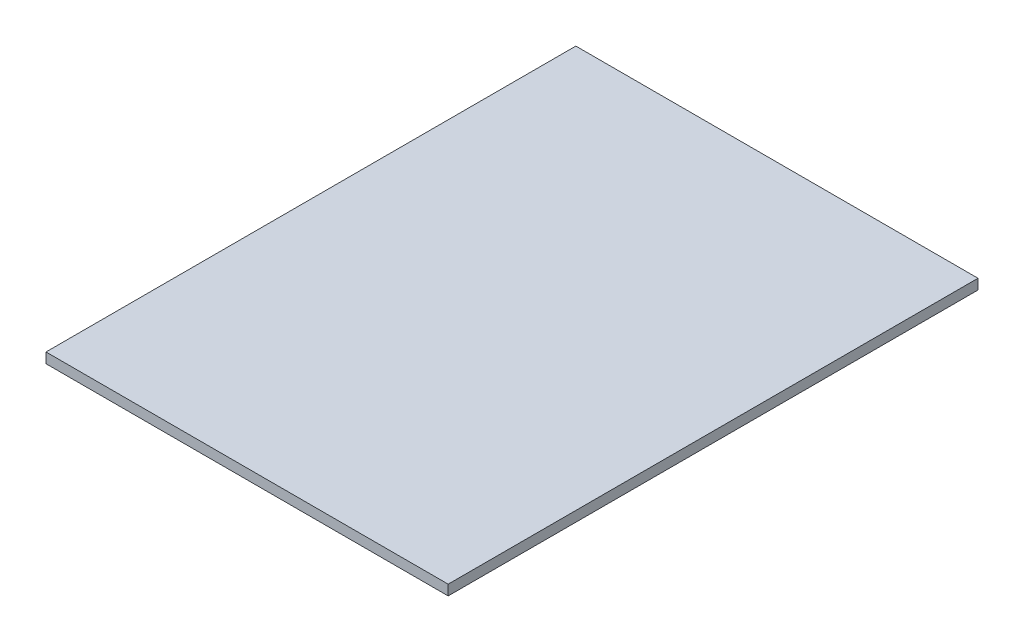
ISO-10303-21;
HEADER;
FILE_DESCRIPTION(('STEP AP214'),'2;1');
FILE_NAME('part.step','',(''),(''),'','','');
FILE_SCHEMA(('AUTOMOTIVE_DESIGN { 1 0 10303 214 1 1 1 1 }'));
ENDSEC;
DATA;
#1=APPLICATION_CONTEXT('core data for automotive mechanical design processes');
#2=APPLICATION_PROTOCOL_DEFINITION('international standard','automotive_design',2000,#1);
#3=PRODUCT_CONTEXT('',#1,'mechanical');
#4=PRODUCT('Part','Part','',(#3));
#5=PRODUCT_RELATED_PRODUCT_CATEGORY('part','',(#4));
#6=PRODUCT_DEFINITION_FORMATION('','',#4);
#7=PRODUCT_DEFINITION_CONTEXT('part definition',#1,'design');
#8=PRODUCT_DEFINITION('design','',#6,#7);
#9=PRODUCT_DEFINITION_SHAPE('','',#8);
#10=(LENGTH_UNIT() NAMED_UNIT(*) SI_UNIT(.MILLI.,.METRE.));
#11=(NAMED_UNIT(*) PLANE_ANGLE_UNIT() SI_UNIT($,.RADIAN.));
#12=(NAMED_UNIT(*) SI_UNIT($,.STERADIAN.) SOLID_ANGLE_UNIT());
#13=UNCERTAINTY_MEASURE_WITH_UNIT(LENGTH_MEASURE(1.E-05),#10,'distance_accuracy_value','');
#14=(GEOMETRIC_REPRESENTATION_CONTEXT(3) GLOBAL_UNCERTAINTY_ASSIGNED_CONTEXT((#13)) GLOBAL_UNIT_ASSIGNED_CONTEXT((#10,
#11,#12)) REPRESENTATION_CONTEXT('',''));
#15=CARTESIAN_POINT('',(0.,0.,0.));
#16=DIRECTION('',(0.,0.,1.));
#17=DIRECTION('',(1.,0.,0.));
#18=AXIS2_PLACEMENT_3D('',#15,#16,#17);
#19=CARTESIAN_POINT('',(-34.115,5.44999999999999,-41.5));
#20=DIRECTION('',(0.,0.,-1.));
#21=DIRECTION('',(-1.,0.,0.));
#22=AXIS2_PLACEMENT_3D('',#19,#20,#21);
#23=PLANE('',#22);
#24=DIRECTION('',(-1.,0.,0.));
#25=VECTOR('',#24,1.);
#26=CARTESIAN_POINT('',(31.5,-5.5,-41.5));
#27=LINE('',#26,#25);
#28=CARTESIAN_POINT('',(31.5,-5.5,-41.5));
#29=VERTEX_POINT('',#28);
#30=CARTESIAN_POINT('',(-31.5,-5.49999999999999,-41.5));
#31=VERTEX_POINT('',#30);
#32=EDGE_CURVE('E52',#29,#31,#27,.T.);
#33=ORIENTED_EDGE('',*,*,#32,.F.);
#34=DIRECTION('',(0.,1.,0.));
#35=VECTOR('',#34,1.);
#36=CARTESIAN_POINT('',(31.5,-5.5,-41.5));
#37=LINE('',#36,#35);
#38=CARTESIAN_POINT('',(31.5,-7.1,-41.5));
#39=VERTEX_POINT('',#38);
#40=EDGE_CURVE('E118',#39,#29,#37,.T.);
#41=ORIENTED_EDGE('',*,*,#40,.F.);
#42=DIRECTION('',(1.,0.,0.));
#43=VECTOR('',#42,1.);
#44=CARTESIAN_POINT('',(31.5,-7.1,-41.5));
#45=LINE('',#44,#43);
#46=CARTESIAN_POINT('',(-31.5,-7.09999999999999,-41.5));
#47=VERTEX_POINT('',#46);
#48=EDGE_CURVE('E67',#47,#39,#45,.T.);
#49=ORIENTED_EDGE('',*,*,#48,.F.);
#50=DIRECTION('',(0.,-1.,0.));
#51=VECTOR('',#50,1.);
#52=CARTESIAN_POINT('',(-31.5,-5.49999999999999,-41.5));
#53=LINE('',#52,#51);
#54=EDGE_CURVE('E58',#31,#47,#53,.T.);
#55=ORIENTED_EDGE('',*,*,#54,.F.);
#56=EDGE_LOOP('',(#33,#41,#49,#55));
#57=FACE_BOUND('',#56,.T.);
#58=ADVANCED_FACE('F44',(#57),#23,.T.);
#59=CARTESIAN_POINT('',(-31.5,-5.49999999999999,-104.67031418519));
#60=DIRECTION('',(-1.,0.,0.));
#61=DIRECTION('',(0.,0.,1.));
#62=AXIS2_PLACEMENT_3D('',#59,#60,#61);
#63=PLANE('',#62);
#64=DIRECTION('',(0.,0.,1.));
#65=VECTOR('',#64,1.);
#66=CARTESIAN_POINT('',(-31.5,-5.49999999999999,-104.67031418519));
#67=LINE('',#66,#65);
#68=CARTESIAN_POINT('',(-31.5,-5.49999999999999,41.5));
#69=VERTEX_POINT('',#68);
#70=EDGE_CURVE('E11',#31,#69,#67,.T.);
#71=ORIENTED_EDGE('',*,*,#70,.F.);
#72=ORIENTED_EDGE('',*,*,#54,.T.);
#73=DIRECTION('',(0.,0.,1.));
#74=VECTOR('',#73,1.);
#75=CARTESIAN_POINT('',(-31.5,-7.09999999999999,-104.67031418519));
#76=LINE('',#75,#74);
#77=CARTESIAN_POINT('',(-31.5,-7.09999999999999,41.5));
#78=VERTEX_POINT('',#77);
#79=EDGE_CURVE('E105',#47,#78,#76,.T.);
#80=ORIENTED_EDGE('',*,*,#79,.T.);
#81=DIRECTION('',(0.,-1.,0.));
#82=VECTOR('',#81,1.);
#83=CARTESIAN_POINT('',(-31.5,-5.49999999999999,41.5));
#84=LINE('',#83,#82);
#85=EDGE_CURVE('E99',#69,#78,#84,.T.);
#86=ORIENTED_EDGE('',*,*,#85,.F.);
#87=EDGE_LOOP('',(#71,#72,#80,#86));
#88=FACE_BOUND('',#87,.T.);
#89=ADVANCED_FACE('F102',(#88),#63,.T.);
#90=CARTESIAN_POINT('',(31.5,-7.1,-104.67031418519));
#91=DIRECTION('',(0.,-1.,0.));
#92=DIRECTION('',(1.,0.,0.));
#93=AXIS2_PLACEMENT_3D('',#90,#91,#92);
#94=PLANE('',#93);
#95=ORIENTED_EDGE('',*,*,#79,.F.);
#96=ORIENTED_EDGE('',*,*,#48,.T.);
#97=DIRECTION('',(0.,0.,1.));
#98=VECTOR('',#97,1.);
#99=CARTESIAN_POINT('',(31.5,-7.1,-104.67031418519));
#100=LINE('',#99,#98);
#101=CARTESIAN_POINT('',(31.5,-7.1,41.5));
#102=VERTEX_POINT('',#101);
#103=EDGE_CURVE('E90',#39,#102,#100,.T.);
#104=ORIENTED_EDGE('',*,*,#103,.T.);
#105=DIRECTION('',(1.,0.,0.));
#106=VECTOR('',#105,1.);
#107=CARTESIAN_POINT('',(31.5,-7.1,41.5));
#108=LINE('',#107,#106);
#109=EDGE_CURVE('E107',#78,#102,#108,.T.);
#110=ORIENTED_EDGE('',*,*,#109,.F.);
#111=EDGE_LOOP('',(#95,#96,#104,#110));
#112=FACE_BOUND('',#111,.T.);
#113=ADVANCED_FACE('F127',(#112),#94,.T.);
#114=CARTESIAN_POINT('',(31.5,-5.5,-104.67031418519));
#115=DIRECTION('',(1.,0.,0.));
#116=DIRECTION('',(0.,0.,-1.));
#117=AXIS2_PLACEMENT_3D('',#114,#115,#116);
#118=PLANE('',#117);
#119=ORIENTED_EDGE('',*,*,#103,.F.);
#120=ORIENTED_EDGE('',*,*,#40,.T.);
#121=DIRECTION('',(0.,0.,1.));
#122=VECTOR('',#121,1.);
#123=CARTESIAN_POINT('',(31.5,-5.5,-104.67031418519));
#124=LINE('',#123,#122);
#125=CARTESIAN_POINT('',(31.5,-5.5,41.5));
#126=VERTEX_POINT('',#125);
#127=EDGE_CURVE('E80',#29,#126,#124,.T.);
#128=ORIENTED_EDGE('',*,*,#127,.T.);
#129=DIRECTION('',(0.,1.,0.));
#130=VECTOR('',#129,1.);
#131=CARTESIAN_POINT('',(31.5,-5.5,41.5));
#132=LINE('',#131,#130);
#133=EDGE_CURVE('E106',#102,#126,#132,.T.);
#134=ORIENTED_EDGE('',*,*,#133,.F.);
#135=EDGE_LOOP('',(#119,#120,#128,#134));
#136=FACE_BOUND('',#135,.T.);
#137=ADVANCED_FACE('F135',(#136),#118,.T.);
#138=CARTESIAN_POINT('',(31.5,-5.5,-104.67031418519));
#139=DIRECTION('',(0.,1.,0.));
#140=DIRECTION('',(-1.,0.,0.));
#141=AXIS2_PLACEMENT_3D('',#138,#139,#140);
#142=PLANE('',#141);
#143=ORIENTED_EDGE('',*,*,#127,.F.);
#144=ORIENTED_EDGE('',*,*,#32,.T.);
#145=ORIENTED_EDGE('',*,*,#70,.T.);
#146=DIRECTION('',(-1.,0.,0.));
#147=VECTOR('',#146,1.);
#148=CARTESIAN_POINT('',(31.5,-5.5,41.5));
#149=LINE('',#148,#147);
#150=EDGE_CURVE('E96',#126,#69,#149,.T.);
#151=ORIENTED_EDGE('',*,*,#150,.F.);
#152=EDGE_LOOP('',(#143,#144,#145,#151));
#153=FACE_BOUND('',#152,.T.);
#154=ADVANCED_FACE('F92',(#153),#142,.T.);
#155=CARTESIAN_POINT('',(34.115,5.44999999999999,41.5));
#156=DIRECTION('',(0.,0.,1.));
#157=DIRECTION('',(1.,0.,0.));
#158=AXIS2_PLACEMENT_3D('',#155,#156,#157);
#159=PLANE('',#158);
#160=ORIENTED_EDGE('',*,*,#133,.T.);
#161=ORIENTED_EDGE('',*,*,#150,.T.);
#162=ORIENTED_EDGE('',*,*,#85,.T.);
#163=ORIENTED_EDGE('',*,*,#109,.T.);
#164=EDGE_LOOP('',(#160,#161,#162,#163));
#165=FACE_BOUND('',#164,.T.);
#166=ADVANCED_FACE('F110',(#165),#159,.T.);
#167=CLOSED_SHELL('',(#58,#89,#113,#137,#154,#166));
#168=MANIFOLD_SOLID_BREP('B2',#167);
#169=ADVANCED_BREP_SHAPE_REPRESENTATION('',(#18,#168),#14);
#170=SHAPE_DEFINITION_REPRESENTATION(#9,#169);
ENDSEC;
END-ISO-10303-21;
